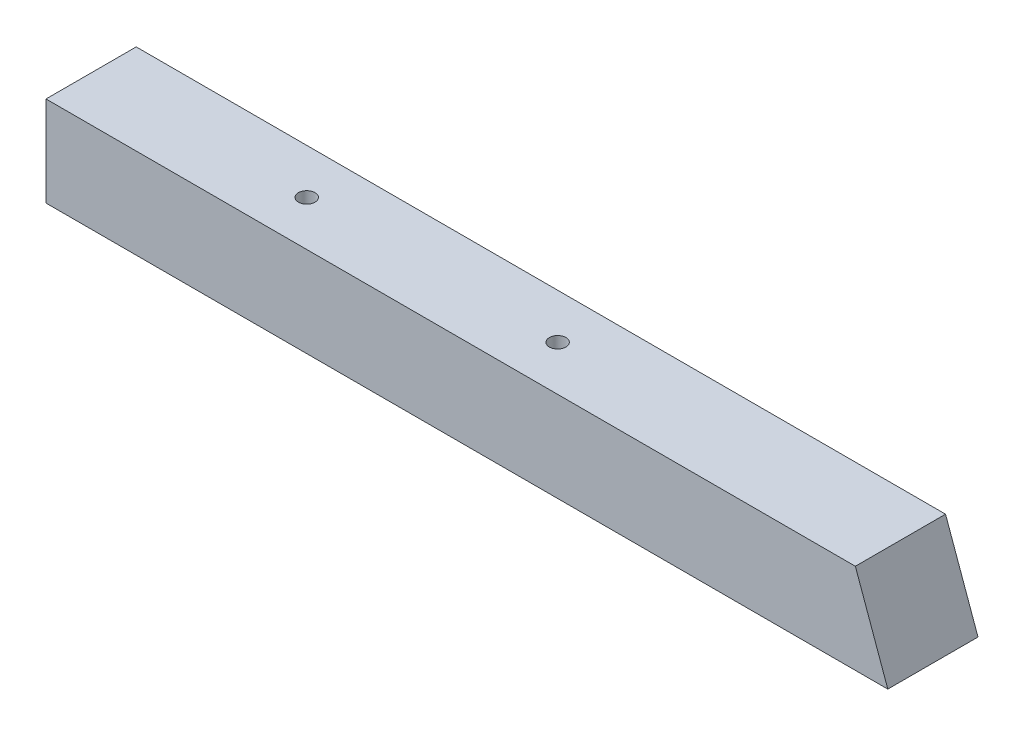
ISO-10303-21;
HEADER;
FILE_DESCRIPTION(('STEP AP214'),'2;1');
FILE_NAME('part.step','',(''),(''),'','','');
FILE_SCHEMA(('AUTOMOTIVE_DESIGN { 1 0 10303 214 1 1 1 1 }'));
ENDSEC;
DATA;
#1=APPLICATION_CONTEXT('core data for automotive mechanical design processes');
#2=APPLICATION_PROTOCOL_DEFINITION('international standard','automotive_design',2000,#1);
#3=PRODUCT_CONTEXT('',#1,'mechanical');
#4=PRODUCT('Part','Part','',(#3));
#5=PRODUCT_RELATED_PRODUCT_CATEGORY('part','',(#4));
#6=PRODUCT_DEFINITION_FORMATION('','',#4);
#7=PRODUCT_DEFINITION_CONTEXT('part definition',#1,'design');
#8=PRODUCT_DEFINITION('design','',#6,#7);
#9=PRODUCT_DEFINITION_SHAPE('','',#8);
#10=(LENGTH_UNIT() NAMED_UNIT(*) SI_UNIT(.MILLI.,.METRE.));
#11=(NAMED_UNIT(*) PLANE_ANGLE_UNIT() SI_UNIT($,.RADIAN.));
#12=(NAMED_UNIT(*) SI_UNIT($,.STERADIAN.) SOLID_ANGLE_UNIT());
#13=UNCERTAINTY_MEASURE_WITH_UNIT(LENGTH_MEASURE(1.E-05),#10,'distance_accuracy_value','');
#14=(GEOMETRIC_REPRESENTATION_CONTEXT(3) GLOBAL_UNCERTAINTY_ASSIGNED_CONTEXT((#13)) GLOBAL_UNIT_ASSIGNED_CONTEXT((#10,
#11,#12)) REPRESENTATION_CONTEXT('',''));
#15=CARTESIAN_POINT('',(0.,0.,0.));
#16=DIRECTION('',(0.,0.,1.));
#17=DIRECTION('',(1.,0.,0.));
#18=AXIS2_PLACEMENT_3D('',#15,#16,#17);
#19=CARTESIAN_POINT('',(355.6,19.05,-19.05));
#20=DIRECTION('',(0.,0.,1.));
#21=DIRECTION('',(1.,0.,0.));
#22=AXIS2_PLACEMENT_3D('',#19,#20,#21);
#23=PLANE('',#22);
#24=DIRECTION('',(-1.,0.,0.));
#25=VECTOR('',#24,1.);
#26=CARTESIAN_POINT('',(355.6,19.05,-19.05));
#27=LINE('',#26,#25);
#28=CARTESIAN_POINT('',(341.890667107375,19.05,-19.05));
#29=VERTEX_POINT('',#28);
#30=CARTESIAN_POINT('',(0.,19.05,-19.05));
#31=VERTEX_POINT('',#30);
#32=EDGE_CURVE('E11',#29,#31,#27,.T.);
#33=ORIENTED_EDGE('',*,*,#32,.F.);
#34=DIRECTION('',(0.338573700413976,-0.94093987554359,0.));
#35=VECTOR('',#34,1.);
#36=CARTESIAN_POINT('',(355.6,-19.05,-19.05));
#37=LINE('',#36,#35);
#38=CARTESIAN_POINT('',(355.6,-19.05,-19.05));
#39=VERTEX_POINT('',#38);
#40=EDGE_CURVE('E117',#29,#39,#37,.T.);
#41=ORIENTED_EDGE('',*,*,#40,.T.);
#42=DIRECTION('',(-1.,0.,0.));
#43=VECTOR('',#42,1.);
#44=CARTESIAN_POINT('',(355.6,-19.05,-19.05));
#45=LINE('',#44,#43);
#46=CARTESIAN_POINT('',(0.,-19.05,-19.05));
#47=VERTEX_POINT('',#46);
#48=EDGE_CURVE('E93',#39,#47,#45,.T.);
#49=ORIENTED_EDGE('',*,*,#48,.T.);
#50=DIRECTION('',(0.,1.,0.));
#51=VECTOR('',#50,1.);
#52=CARTESIAN_POINT('',(0.,19.05,-19.05));
#53=LINE('',#52,#51);
#54=EDGE_CURVE('E98',#47,#31,#53,.T.);
#55=ORIENTED_EDGE('',*,*,#54,.T.);
#56=EDGE_LOOP('',(#33,#41,#49,#55));
#57=FACE_BOUND('',#56,.T.);
#58=ADVANCED_FACE('F41',(#57),#23,.F.);
#59=CARTESIAN_POINT('',(355.6,19.05,19.05));
#60=DIRECTION('',(0.,-1.,0.));
#61=DIRECTION('',(0.,0.,-1.));
#62=AXIS2_PLACEMENT_3D('',#59,#60,#61);
#63=PLANE('',#62);
#64=CARTESIAN_POINT('',(91.088392372,19.05,0.));
#65=DIRECTION('',(0.,-1.,0.));
#66=DIRECTION('',(0.,0.,-1.));
#67=AXIS2_PLACEMENT_3D('',#64,#65,#66);
#68=CIRCLE('',#67,3.50000000000001);
#69=CARTESIAN_POINT('',(91.088392372,19.05,-3.50000000000001));
#70=VERTEX_POINT('',#69);
#71=EDGE_CURVE('E127',#70,#70,#68,.T.);
#72=ORIENTED_EDGE('',*,*,#71,.T.);
#73=EDGE_LOOP('',(#72));
#74=FACE_BOUND('',#73,.T.);
#75=CARTESIAN_POINT('',(197.087368962323,19.05,0.));
#76=DIRECTION('',(0.,-1.,0.));
#77=DIRECTION('',(0.,0.,-1.));
#78=AXIS2_PLACEMENT_3D('',#75,#76,#77);
#79=CIRCLE('',#78,3.49999999999999);
#80=CARTESIAN_POINT('',(197.087368962323,19.05,-3.49999999999997));
#81=VERTEX_POINT('',#80);
#82=EDGE_CURVE('E141',#81,#81,#79,.T.);
#83=ORIENTED_EDGE('',*,*,#82,.T.);
#84=EDGE_LOOP('',(#83));
#85=FACE_BOUND('',#84,.T.);
#86=DIRECTION('',(-1.,0.,0.));
#87=VECTOR('',#86,1.);
#88=CARTESIAN_POINT('',(355.6,19.05,19.05));
#89=LINE('',#88,#87);
#90=CARTESIAN_POINT('',(341.890667107375,19.05,19.05));
#91=VERTEX_POINT('',#90);
#92=CARTESIAN_POINT('',(0.,19.05,19.05));
#93=VERTEX_POINT('',#92);
#94=EDGE_CURVE('E50',#91,#93,#89,.T.);
#95=ORIENTED_EDGE('',*,*,#94,.F.);
#96=DIRECTION('',(0.,0.,1.));
#97=VECTOR('',#96,1.);
#98=CARTESIAN_POINT('',(341.890667107375,19.05,-19.05));
#99=LINE('',#98,#97);
#100=EDGE_CURVE('E121',#29,#91,#99,.T.);
#101=ORIENTED_EDGE('',*,*,#100,.F.);
#102=ORIENTED_EDGE('',*,*,#32,.T.);
#103=DIRECTION('',(0.,0.,1.));
#104=VECTOR('',#103,1.);
#105=CARTESIAN_POINT('',(0.,19.05,19.05));
#106=LINE('',#105,#104);
#107=EDGE_CURVE('E85',#31,#93,#106,.T.);
#108=ORIENTED_EDGE('',*,*,#107,.T.);
#109=EDGE_LOOP('',(#95,#101,#102,#108));
#110=FACE_BOUND('',#109,.T.);
#111=ADVANCED_FACE('F129',(#74,#85,#110),#63,.F.);
#112=CARTESIAN_POINT('',(355.6,19.05,19.05));
#113=DIRECTION('',(0.,0.,-1.));
#114=DIRECTION('',(0.,1.,0.));
#115=AXIS2_PLACEMENT_3D('',#112,#113,#114);
#116=PLANE('',#115);
#117=DIRECTION('',(-1.,0.,0.));
#118=VECTOR('',#117,1.);
#119=CARTESIAN_POINT('',(355.6,-19.05,19.05));
#120=LINE('',#119,#118);
#121=CARTESIAN_POINT('',(355.6,-19.05,19.05));
#122=VERTEX_POINT('',#121);
#123=CARTESIAN_POINT('',(0.,-19.05,19.05));
#124=VERTEX_POINT('',#123);
#125=EDGE_CURVE('E76',#122,#124,#120,.T.);
#126=ORIENTED_EDGE('',*,*,#125,.F.);
#127=DIRECTION('',(0.338573700413976,-0.94093987554359,0.));
#128=VECTOR('',#127,1.);
#129=CARTESIAN_POINT('',(355.6,-19.05,19.05));
#130=LINE('',#129,#128);
#131=EDGE_CURVE('E57',#91,#122,#130,.T.);
#132=ORIENTED_EDGE('',*,*,#131,.F.);
#133=ORIENTED_EDGE('',*,*,#94,.T.);
#134=DIRECTION('',(0.,-1.,0.));
#135=VECTOR('',#134,1.);
#136=CARTESIAN_POINT('',(0.,19.05,19.05));
#137=LINE('',#136,#135);
#138=EDGE_CURVE('E73',#93,#124,#137,.T.);
#139=ORIENTED_EDGE('',*,*,#138,.T.);
#140=EDGE_LOOP('',(#126,#132,#133,#139));
#141=FACE_BOUND('',#140,.T.);
#142=ADVANCED_FACE('F75',(#141),#116,.F.);
#143=CARTESIAN_POINT('',(355.6,-19.05,19.05));
#144=DIRECTION('',(0.,1.,0.));
#145=DIRECTION('',(0.,0.,1.));
#146=AXIS2_PLACEMENT_3D('',#143,#144,#145);
#147=PLANE('',#146);
#148=CARTESIAN_POINT('',(91.088392372,-19.05,0.));
#149=DIRECTION('',(0.,-1.,0.));
#150=DIRECTION('',(0.,0.,-1.));
#151=AXIS2_PLACEMENT_3D('',#148,#149,#150);
#152=CIRCLE('',#151,3.50000000000001);
#153=CARTESIAN_POINT('',(91.088392372,-19.05,-3.50000000000001));
#154=VERTEX_POINT('',#153);
#155=EDGE_CURVE('E145',#154,#154,#152,.T.);
#156=ORIENTED_EDGE('',*,*,#155,.F.);
#157=EDGE_LOOP('',(#156));
#158=FACE_BOUND('',#157,.T.);
#159=CARTESIAN_POINT('',(197.087368962323,-19.05,0.));
#160=DIRECTION('',(0.,-1.,0.));
#161=DIRECTION('',(0.,0.,-1.));
#162=AXIS2_PLACEMENT_3D('',#159,#160,#161);
#163=CIRCLE('',#162,3.49999999999999);
#164=CARTESIAN_POINT('',(197.087368962323,-19.05,-3.49999999999997));
#165=VERTEX_POINT('',#164);
#166=EDGE_CURVE('E137',#165,#165,#163,.T.);
#167=ORIENTED_EDGE('',*,*,#166,.F.);
#168=EDGE_LOOP('',(#167));
#169=FACE_BOUND('',#168,.T.);
#170=DIRECTION('',(0.,0.,-1.));
#171=VECTOR('',#170,1.);
#172=CARTESIAN_POINT('',(0.,-19.05,19.05));
#173=LINE('',#172,#171);
#174=EDGE_CURVE('E84',#124,#47,#173,.T.);
#175=ORIENTED_EDGE('',*,*,#174,.T.);
#176=ORIENTED_EDGE('',*,*,#48,.F.);
#177=DIRECTION('',(0.,0.,-1.));
#178=VECTOR('',#177,1.);
#179=CARTESIAN_POINT('',(355.6,-19.05,19.05));
#180=LINE('',#179,#178);
#181=EDGE_CURVE('E91',#122,#39,#180,.T.);
#182=ORIENTED_EDGE('',*,*,#181,.F.);
#183=ORIENTED_EDGE('',*,*,#125,.T.);
#184=EDGE_LOOP('',(#175,#176,#182,#183));
#185=FACE_BOUND('',#184,.T.);
#186=ADVANCED_FACE('F88',(#158,#169,#185),#147,.F.);
#187=CARTESIAN_POINT('',(0.,0.,0.));
#188=DIRECTION('',(1.,0.,0.));
#189=DIRECTION('',(0.,0.,-1.));
#190=AXIS2_PLACEMENT_3D('',#187,#188,#189);
#191=PLANE('',#190);
#192=ORIENTED_EDGE('',*,*,#54,.F.);
#193=ORIENTED_EDGE('',*,*,#174,.F.);
#194=ORIENTED_EDGE('',*,*,#138,.F.);
#195=ORIENTED_EDGE('',*,*,#107,.F.);
#196=EDGE_LOOP('',(#192,#193,#194,#195));
#197=FACE_BOUND('',#196,.T.);
#198=ADVANCED_FACE('F96',(#197),#191,.F.);
#199=CARTESIAN_POINT('',(355.6,-19.05,-19.05));
#200=DIRECTION('',(-0.94093987554359,-0.338573700413976,0.));
#201=DIRECTION('',(0.338573700413976,-0.940939875543591,0.));
#202=AXIS2_PLACEMENT_3D('',#199,#200,#201);
#203=PLANE('',#202);
#204=ORIENTED_EDGE('',*,*,#131,.T.);
#205=ORIENTED_EDGE('',*,*,#181,.T.);
#206=ORIENTED_EDGE('',*,*,#40,.F.);
#207=ORIENTED_EDGE('',*,*,#100,.T.);
#208=EDGE_LOOP('',(#204,#205,#206,#207));
#209=FACE_BOUND('',#208,.T.);
#210=ADVANCED_FACE('F122',(#209),#203,.F.);
#211=CARTESIAN_POINT('',(197.087368962323,19.05,0.));
#212=DIRECTION('',(0.,-1.,0.));
#213=DIRECTION('',(0.,0.,-1.));
#214=AXIS2_PLACEMENT_3D('',#211,#212,#213);
#215=CYLINDRICAL_SURFACE('',#214,3.49999999999999);
#216=CARTESIAN_POINT('',(197.087368962323,19.05,-3.49999999999997));
#217=CARTESIAN_POINT('',(197.087368962323,18.653125,-3.49999999999997));
#218=CARTESIAN_POINT('',(197.087368962323,18.25625,-3.49999999999997));
#219=CARTESIAN_POINT('',(197.087368962323,17.4625,-3.49999999999997));
#220=CARTESIAN_POINT('',(197.087368962323,17.065625,-3.49999999999997));
#221=CARTESIAN_POINT('',(197.087368962323,16.271875,-3.49999999999997));
#222=CARTESIAN_POINT('',(197.087368962323,15.875,-3.49999999999997));
#223=CARTESIAN_POINT('',(197.087368962323,15.08125,-3.49999999999997));
#224=CARTESIAN_POINT('',(197.087368962323,14.684375,-3.49999999999997));
#225=CARTESIAN_POINT('',(197.087368962323,13.890625,-3.49999999999997));
#226=CARTESIAN_POINT('',(197.087368962323,13.49375,-3.49999999999997));
#227=CARTESIAN_POINT('',(197.087368962323,12.7,-3.49999999999997));
#228=CARTESIAN_POINT('',(197.087368962323,12.303125,-3.49999999999997));
#229=CARTESIAN_POINT('',(197.087368962323,11.509375,-3.49999999999997));
#230=CARTESIAN_POINT('',(197.087368962323,11.1125,-3.49999999999997));
#231=CARTESIAN_POINT('',(197.087368962323,10.31875,-3.49999999999997));
#232=CARTESIAN_POINT('',(197.087368962323,9.92187500000001,-3.49999999999997));
#233=CARTESIAN_POINT('',(197.087368962323,9.12812500000001,-3.49999999999997));
#234=CARTESIAN_POINT('',(197.087368962323,8.73125,-3.49999999999997));
#235=CARTESIAN_POINT('',(197.087368962323,7.93750000000001,-3.49999999999997));
#236=CARTESIAN_POINT('',(197.087368962323,7.540625,-3.49999999999997));
#237=CARTESIAN_POINT('',(197.087368962323,6.746875,-3.49999999999997));
#238=CARTESIAN_POINT('',(197.087368962323,6.35,-3.49999999999997));
#239=CARTESIAN_POINT('',(197.087368962323,5.55625,-3.49999999999997));
#240=CARTESIAN_POINT('',(197.087368962323,5.15937500000001,-3.49999999999997));
#241=CARTESIAN_POINT('',(197.087368962323,4.365625,-3.49999999999997));
#242=CARTESIAN_POINT('',(197.087368962323,3.96875,-3.49999999999997));
#243=CARTESIAN_POINT('',(197.087368962323,3.175,-3.49999999999997));
#244=CARTESIAN_POINT('',(197.087368962323,2.778125,-3.49999999999997));
#245=CARTESIAN_POINT('',(197.087368962323,1.984375,-3.49999999999997));
#246=CARTESIAN_POINT('',(197.087368962323,1.5875,-3.49999999999997));
#247=CARTESIAN_POINT('',(197.087368962323,0.793750000000004,-3.49999999999997));
#248=CARTESIAN_POINT('',(197.087368962323,0.396875000000004,-3.49999999999997));
#249=CARTESIAN_POINT('',(197.087368962323,-0.396874999999997,-3.49999999999997));
#250=CARTESIAN_POINT('',(197.087368962323,-0.793749999999997,-3.49999999999997));
#251=CARTESIAN_POINT('',(197.087368962323,-1.5875,-3.49999999999997));
#252=CARTESIAN_POINT('',(197.087368962323,-1.984375,-3.49999999999997));
#253=CARTESIAN_POINT('',(197.087368962323,-2.778125,-3.49999999999997));
#254=CARTESIAN_POINT('',(197.087368962323,-3.175,-3.49999999999997));
#255=CARTESIAN_POINT('',(197.087368962323,-3.96875,-3.49999999999997));
#256=CARTESIAN_POINT('',(197.087368962323,-4.365625,-3.49999999999997));
#257=CARTESIAN_POINT('',(197.087368962323,-5.159375,-3.49999999999997));
#258=CARTESIAN_POINT('',(197.087368962323,-5.55625,-3.49999999999997));
#259=CARTESIAN_POINT('',(197.087368962323,-6.35,-3.49999999999997));
#260=CARTESIAN_POINT('',(197.087368962323,-6.746875,-3.49999999999997));
#261=CARTESIAN_POINT('',(197.087368962323,-7.540625,-3.49999999999997));
#262=CARTESIAN_POINT('',(197.087368962323,-7.9375,-3.49999999999997));
#263=CARTESIAN_POINT('',(197.087368962323,-8.73125,-3.49999999999997));
#264=CARTESIAN_POINT('',(197.087368962323,-9.128125,-3.49999999999997));
#265=CARTESIAN_POINT('',(197.087368962323,-9.921875,-3.49999999999997));
#266=CARTESIAN_POINT('',(197.087368962323,-10.31875,-3.49999999999997));
#267=CARTESIAN_POINT('',(197.087368962323,-11.1125,-3.49999999999997));
#268=CARTESIAN_POINT('',(197.087368962323,-11.509375,-3.49999999999997));
#269=CARTESIAN_POINT('',(197.087368962323,-12.303125,-3.49999999999997));
#270=CARTESIAN_POINT('',(197.087368962323,-12.7,-3.49999999999997));
#271=CARTESIAN_POINT('',(197.087368962323,-13.49375,-3.49999999999997));
#272=CARTESIAN_POINT('',(197.087368962323,-13.890625,-3.49999999999997));
#273=CARTESIAN_POINT('',(197.087368962323,-14.684375,-3.49999999999997));
#274=CARTESIAN_POINT('',(197.087368962323,-15.08125,-3.49999999999997));
#275=CARTESIAN_POINT('',(197.087368962323,-15.875,-3.49999999999997));
#276=CARTESIAN_POINT('',(197.087368962323,-16.271875,-3.49999999999997));
#277=CARTESIAN_POINT('',(197.087368962323,-17.065625,-3.49999999999997));
#278=CARTESIAN_POINT('',(197.087368962323,-17.4625,-3.49999999999997));
#279=CARTESIAN_POINT('',(197.087368962323,-18.25625,-3.49999999999997));
#280=CARTESIAN_POINT('',(197.087368962323,-18.653125,-3.49999999999997));
#281=CARTESIAN_POINT('',(197.087368962323,-19.05,-3.49999999999997));
#282=B_SPLINE_CURVE_WITH_KNOTS('',3,(#216,#217,#218,#219,#220,#221,#222,#223,#224,#225,#226,
#227,#228,#229,#230,#231,#232,#233,#234,#235,#236,#237,#238,#239,#240,#241,#242,#243,#244,#245,
#246,#247,#248,#249,#250,#251,#252,#253,#254,#255,#256,#257,#258,#259,#260,#261,#262,#263,#264,
#265,#266,#267,#268,#269,#270,#271,#272,#273,#274,#275,#276,#277,#278,#279,#280,#281),
.UNSPECIFIED.,.F.,.F.,(4,2,2,2,2,2,2,2,2,2,2,2,2,2,2,2,2,2,2,2,2,2,2,2,2,2,2,2,2,2,2,2,4),(0.,
1.190625,2.38125,3.571875,4.7625,5.953125,7.14375,8.334375,9.525,10.715625,11.90625,13.096875,
14.2875,15.478125,16.66875,17.859375,19.05,20.240625,21.43125,22.621875,23.8125,25.003125,
26.19375,27.384375,28.575,29.765625,30.95625,32.146875,33.3375,34.528125,35.71875,36.909375,
38.1),.UNSPECIFIED.);
#283=EDGE_CURVE('BSEAM159',#81,#165,#282,.T.);
#284=ORIENTED_EDGE('',*,*,#82,.F.);
#285=ORIENTED_EDGE('',*,*,#166,.T.);
#286=ORIENTED_EDGE('',*,*,#283,.T.);
#287=ORIENTED_EDGE('',*,*,#283,.F.);
#288=EDGE_LOOP('',(#284,#286,#285,#287));
#289=FACE_BOUND('',#288,.T.);
#290=ADVANCED_FACE('F159',(#289),#215,.F.);
#291=CARTESIAN_POINT('',(91.088392372,19.05,0.));
#292=DIRECTION('',(0.,-1.,0.));
#293=DIRECTION('',(0.,0.,-1.));
#294=AXIS2_PLACEMENT_3D('',#291,#292,#293);
#295=CYLINDRICAL_SURFACE('',#294,3.50000000000001);
#296=CARTESIAN_POINT('',(91.088392372,19.05,-3.50000000000001));
#297=CARTESIAN_POINT('',(91.088392372,18.653125,-3.50000000000001));
#298=CARTESIAN_POINT('',(91.088392372,18.25625,-3.50000000000001));
#299=CARTESIAN_POINT('',(91.088392372,17.4625,-3.50000000000001));
#300=CARTESIAN_POINT('',(91.088392372,17.065625,-3.50000000000001));
#301=CARTESIAN_POINT('',(91.088392372,16.271875,-3.50000000000001));
#302=CARTESIAN_POINT('',(91.088392372,15.875,-3.50000000000001));
#303=CARTESIAN_POINT('',(91.088392372,15.08125,-3.50000000000001));
#304=CARTESIAN_POINT('',(91.088392372,14.684375,-3.50000000000001));
#305=CARTESIAN_POINT('',(91.088392372,13.890625,-3.50000000000001));
#306=CARTESIAN_POINT('',(91.088392372,13.49375,-3.50000000000001));
#307=CARTESIAN_POINT('',(91.088392372,12.7,-3.50000000000001));
#308=CARTESIAN_POINT('',(91.088392372,12.303125,-3.50000000000001));
#309=CARTESIAN_POINT('',(91.088392372,11.509375,-3.50000000000001));
#310=CARTESIAN_POINT('',(91.088392372,11.1125,-3.50000000000001));
#311=CARTESIAN_POINT('',(91.088392372,10.31875,-3.50000000000001));
#312=CARTESIAN_POINT('',(91.088392372,9.92187500000001,-3.50000000000001));
#313=CARTESIAN_POINT('',(91.088392372,9.12812500000001,-3.50000000000001));
#314=CARTESIAN_POINT('',(91.088392372,8.73125,-3.50000000000001));
#315=CARTESIAN_POINT('',(91.088392372,7.93750000000001,-3.50000000000001));
#316=CARTESIAN_POINT('',(91.088392372,7.540625,-3.50000000000001));
#317=CARTESIAN_POINT('',(91.088392372,6.746875,-3.50000000000001));
#318=CARTESIAN_POINT('',(91.088392372,6.35,-3.50000000000001));
#319=CARTESIAN_POINT('',(91.088392372,5.55625,-3.50000000000001));
#320=CARTESIAN_POINT('',(91.088392372,5.15937500000001,-3.50000000000001));
#321=CARTESIAN_POINT('',(91.088392372,4.365625,-3.50000000000001));
#322=CARTESIAN_POINT('',(91.088392372,3.96875,-3.50000000000001));
#323=CARTESIAN_POINT('',(91.088392372,3.175,-3.50000000000001));
#324=CARTESIAN_POINT('',(91.088392372,2.778125,-3.50000000000001));
#325=CARTESIAN_POINT('',(91.088392372,1.984375,-3.50000000000001));
#326=CARTESIAN_POINT('',(91.088392372,1.5875,-3.50000000000001));
#327=CARTESIAN_POINT('',(91.088392372,0.793750000000004,-3.50000000000001));
#328=CARTESIAN_POINT('',(91.088392372,0.396875000000004,-3.50000000000001));
#329=CARTESIAN_POINT('',(91.088392372,-0.396874999999997,-3.50000000000001));
#330=CARTESIAN_POINT('',(91.088392372,-0.793749999999997,-3.50000000000001));
#331=CARTESIAN_POINT('',(91.088392372,-1.5875,-3.50000000000001));
#332=CARTESIAN_POINT('',(91.088392372,-1.984375,-3.50000000000001));
#333=CARTESIAN_POINT('',(91.088392372,-2.778125,-3.50000000000001));
#334=CARTESIAN_POINT('',(91.088392372,-3.175,-3.50000000000001));
#335=CARTESIAN_POINT('',(91.088392372,-3.96875,-3.50000000000001));
#336=CARTESIAN_POINT('',(91.088392372,-4.365625,-3.50000000000001));
#337=CARTESIAN_POINT('',(91.088392372,-5.159375,-3.50000000000001));
#338=CARTESIAN_POINT('',(91.088392372,-5.55625,-3.50000000000001));
#339=CARTESIAN_POINT('',(91.088392372,-6.35,-3.50000000000001));
#340=CARTESIAN_POINT('',(91.088392372,-6.746875,-3.50000000000001));
#341=CARTESIAN_POINT('',(91.088392372,-7.540625,-3.50000000000001));
#342=CARTESIAN_POINT('',(91.088392372,-7.9375,-3.50000000000001));
#343=CARTESIAN_POINT('',(91.088392372,-8.73125,-3.50000000000001));
#344=CARTESIAN_POINT('',(91.088392372,-9.128125,-3.50000000000001));
#345=CARTESIAN_POINT('',(91.088392372,-9.921875,-3.50000000000001));
#346=CARTESIAN_POINT('',(91.088392372,-10.31875,-3.50000000000001));
#347=CARTESIAN_POINT('',(91.088392372,-11.1125,-3.50000000000001));
#348=CARTESIAN_POINT('',(91.088392372,-11.509375,-3.50000000000001));
#349=CARTESIAN_POINT('',(91.088392372,-12.303125,-3.50000000000001));
#350=CARTESIAN_POINT('',(91.088392372,-12.7,-3.50000000000001));
#351=CARTESIAN_POINT('',(91.088392372,-13.49375,-3.50000000000001));
#352=CARTESIAN_POINT('',(91.088392372,-13.890625,-3.50000000000001));
#353=CARTESIAN_POINT('',(91.088392372,-14.684375,-3.50000000000001));
#354=CARTESIAN_POINT('',(91.088392372,-15.08125,-3.50000000000001));
#355=CARTESIAN_POINT('',(91.088392372,-15.875,-3.50000000000001));
#356=CARTESIAN_POINT('',(91.088392372,-16.271875,-3.50000000000001));
#357=CARTESIAN_POINT('',(91.088392372,-17.065625,-3.50000000000001));
#358=CARTESIAN_POINT('',(91.088392372,-17.4625,-3.50000000000001));
#359=CARTESIAN_POINT('',(91.088392372,-18.25625,-3.50000000000001));
#360=CARTESIAN_POINT('',(91.088392372,-18.653125,-3.50000000000001));
#361=CARTESIAN_POINT('',(91.088392372,-19.05,-3.50000000000001));
#362=B_SPLINE_CURVE_WITH_KNOTS('',3,(#296,#297,#298,#299,#300,#301,#302,#303,#304,#305,#306,
#307,#308,#309,#310,#311,#312,#313,#314,#315,#316,#317,#318,#319,#320,#321,#322,#323,#324,#325,
#326,#327,#328,#329,#330,#331,#332,#333,#334,#335,#336,#337,#338,#339,#340,#341,#342,#343,#344,
#345,#346,#347,#348,#349,#350,#351,#352,#353,#354,#355,#356,#357,#358,#359,#360,#361),
.UNSPECIFIED.,.F.,.F.,(4,2,2,2,2,2,2,2,2,2,2,2,2,2,2,2,2,2,2,2,2,2,2,2,2,2,2,2,2,2,2,2,4),(0.,
1.190625,2.38125,3.571875,4.7625,5.953125,7.14375,8.334375,9.525,10.715625,11.90625,13.096875,
14.2875,15.478125,16.66875,17.859375,19.05,20.240625,21.43125,22.621875,23.8125,25.003125,
26.19375,27.384375,28.575,29.765625,30.95625,32.146875,33.3375,34.528125,35.71875,36.909375,
38.1),.UNSPECIFIED.);
#363=EDGE_CURVE('BSEAM156',#70,#154,#362,.T.);
#364=ORIENTED_EDGE('',*,*,#71,.F.);
#365=ORIENTED_EDGE('',*,*,#155,.T.);
#366=ORIENTED_EDGE('',*,*,#363,.T.);
#367=ORIENTED_EDGE('',*,*,#363,.F.);
#368=EDGE_LOOP('',(#364,#366,#365,#367));
#369=FACE_BOUND('',#368,.T.);
#370=ADVANCED_FACE('F156',(#369),#295,.F.);
#371=CLOSED_SHELL('',(#58,#111,#142,#186,#198,#210,#290,#370));
#372=MANIFOLD_SOLID_BREP('B2',#371);
#373=ADVANCED_BREP_SHAPE_REPRESENTATION('',(#18,#372),#14);
#374=SHAPE_DEFINITION_REPRESENTATION(#9,#373);
ENDSEC;
END-ISO-10303-21;
